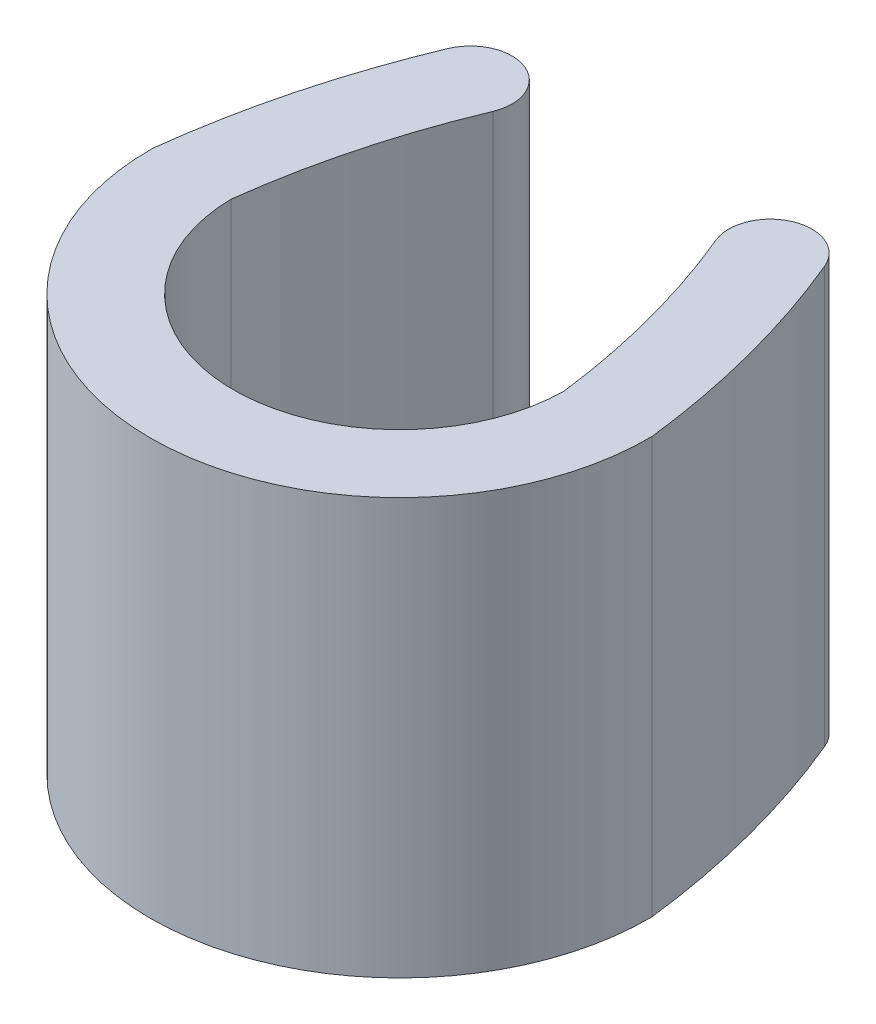
ISO-10303-21;
HEADER;
FILE_DESCRIPTION(('STEP AP214'),'2;1');
FILE_NAME('part.step','',(''),(''),'','','');
FILE_SCHEMA(('AUTOMOTIVE_DESIGN { 1 0 10303 214 1 1 1 1 }'));
ENDSEC;
DATA;
#1=APPLICATION_CONTEXT('core data for automotive mechanical design processes');
#2=APPLICATION_PROTOCOL_DEFINITION('international standard','automotive_design',2000,#1);
#3=PRODUCT_CONTEXT('',#1,'mechanical');
#4=PRODUCT('Part','Part','',(#3));
#5=PRODUCT_RELATED_PRODUCT_CATEGORY('part','',(#4));
#6=PRODUCT_DEFINITION_FORMATION('','',#4);
#7=PRODUCT_DEFINITION_CONTEXT('part definition',#1,'design');
#8=PRODUCT_DEFINITION('design','',#6,#7);
#9=PRODUCT_DEFINITION_SHAPE('','',#8);
#10=(LENGTH_UNIT() NAMED_UNIT(*) SI_UNIT(.MILLI.,.METRE.));
#11=(NAMED_UNIT(*) PLANE_ANGLE_UNIT() SI_UNIT($,.RADIAN.));
#12=(NAMED_UNIT(*) SI_UNIT($,.STERADIAN.) SOLID_ANGLE_UNIT());
#13=UNCERTAINTY_MEASURE_WITH_UNIT(LENGTH_MEASURE(1.E-05),#10,'distance_accuracy_value','');
#14=(GEOMETRIC_REPRESENTATION_CONTEXT(3) GLOBAL_UNCERTAINTY_ASSIGNED_CONTEXT((#13)) GLOBAL_UNIT_ASSIGNED_CONTEXT((#10,
#11,#12)) REPRESENTATION_CONTEXT('',''));
#15=CARTESIAN_POINT('',(0.,0.,0.));
#16=DIRECTION('',(0.,0.,1.));
#17=DIRECTION('',(1.,0.,0.));
#18=AXIS2_PLACEMENT_3D('',#15,#16,#17);
#19=CARTESIAN_POINT('',(-7.42804989922021,5.,1.19742440203698));
#20=DIRECTION('',(0.,-1.,0.));
#21=DIRECTION('',(0.,0.,-1.));
#22=AXIS2_PLACEMENT_3D('',#19,#20,#21);
#23=CYLINDRICAL_SURFACE('',#22,10.5);
#24=CARTESIAN_POINT('',(-7.42804989922021,0.,1.19742440203698));
#25=DIRECTION('',(0.,1.,0.));
#26=DIRECTION('',(0.,0.,1.));
#27=AXIS2_PLACEMENT_3D('',#24,#25,#26);
#28=CIRCLE('',#27,10.5);
#29=CARTESIAN_POINT('',(2.99983941703189,0.,-0.0310398457111388));
#30=VERTEX_POINT('',#29);
#31=CARTESIAN_POINT('',(2.26350014312961,0.,-2.842855016101));
#32=VERTEX_POINT('',#31);
#33=EDGE_CURVE('E145',#30,#32,#28,.T.);
#34=ORIENTED_EDGE('',*,*,#33,.T.);
#35=DIRECTION('',(0.,-1.,0.));
#36=VECTOR('',#35,1.);
#37=CARTESIAN_POINT('',(2.26350014312961,5.,-2.842855016101));
#38=LINE('',#37,#36);
#39=CARTESIAN_POINT('',(2.26350014312961,5.,-2.842855016101));
#40=VERTEX_POINT('',#39);
#41=EDGE_CURVE('E11',#40,#32,#38,.T.);
#42=ORIENTED_EDGE('',*,*,#41,.F.);
#43=CARTESIAN_POINT('',(-7.42804989922021,5.,1.19742440203698));
#44=DIRECTION('',(0.,1.,0.));
#45=DIRECTION('',(0.,0.,1.));
#46=AXIS2_PLACEMENT_3D('',#43,#44,#45);
#47=CIRCLE('',#46,10.5);
#48=CARTESIAN_POINT('',(2.99983941703189,5.,-0.0310398457111388));
#49=VERTEX_POINT('',#48);
#50=EDGE_CURVE('E172',#49,#40,#47,.T.);
#51=ORIENTED_EDGE('',*,*,#50,.F.);
#52=DIRECTION('',(0.,-1.,0.));
#53=VECTOR('',#52,1.);
#54=CARTESIAN_POINT('',(2.99983941703189,5.,-0.0310398457111388));
#55=LINE('',#54,#53);
#56=EDGE_CURVE('E141',#49,#30,#55,.T.);
#57=ORIENTED_EDGE('',*,*,#56,.T.);
#58=EDGE_LOOP('',(#34,#42,#51,#57));
#59=FACE_BOUND('',#58,.T.);
#60=ADVANCED_FACE('F45',(#59),#23,.T.);
#61=CARTESIAN_POINT('',(1.80199776016056,5.,-2.65046075809443));
#62=DIRECTION('',(0.,-1.,0.));
#63=DIRECTION('',(0.,0.,-1.));
#64=AXIS2_PLACEMENT_3D('',#61,#62,#63);
#65=CYLINDRICAL_SURFACE('',#64,0.500000000000001);
#66=CARTESIAN_POINT('',(1.80199776016056,0.,-2.65046075809443));
#67=DIRECTION('',(0.,1.,0.));
#68=DIRECTION('',(0.,0.,1.));
#69=AXIS2_PLACEMENT_3D('',#66,#67,#68);
#70=CIRCLE('',#69,0.500000000000001);
#71=CARTESIAN_POINT('',(1.34049537719153,0.,-2.45806650008786));
#72=VERTEX_POINT('',#71);
#73=EDGE_CURVE('E149',#32,#72,#70,.T.);
#74=ORIENTED_EDGE('',*,*,#73,.T.);
#75=DIRECTION('',(0.,-1.,0.));
#76=VECTOR('',#75,1.);
#77=CARTESIAN_POINT('',(1.34049537719153,5.,-2.45806650008786));
#78=LINE('',#77,#76);
#79=CARTESIAN_POINT('',(1.34049537719153,5.,-2.45806650008786));
#80=VERTEX_POINT('',#79);
#81=EDGE_CURVE('E54',#80,#72,#78,.T.);
#82=ORIENTED_EDGE('',*,*,#81,.F.);
#83=CARTESIAN_POINT('',(1.80199776016056,5.,-2.65046075809443));
#84=DIRECTION('',(0.,1.,0.));
#85=DIRECTION('',(0.,0.,1.));
#86=AXIS2_PLACEMENT_3D('',#83,#84,#85);
#87=CIRCLE('',#86,0.500000000000001);
#88=EDGE_CURVE('E101',#40,#80,#87,.T.);
#89=ORIENTED_EDGE('',*,*,#88,.F.);
#90=ORIENTED_EDGE('',*,*,#41,.T.);
#91=EDGE_LOOP('',(#74,#82,#89,#90));
#92=FACE_BOUND('',#91,.T.);
#93=ADVANCED_FACE('F191',(#92),#65,.T.);
#94=CARTESIAN_POINT('',(-7.42804989922021,5.,1.19742440203698));
#95=DIRECTION('',(0.,-1.,0.));
#96=DIRECTION('',(0.,0.,-1.));
#97=AXIS2_PLACEMENT_3D('',#94,#95,#96);
#98=CYLINDRICAL_SURFACE('',#97,9.5);
#99=CARTESIAN_POINT('',(-7.42804989922021,0.,1.19742440203698));
#100=DIRECTION('',(0.,1.,0.));
#101=DIRECTION('',(0.,0.,1.));
#102=AXIS2_PLACEMENT_3D('',#99,#100,#101);
#103=CIRCLE('',#102,9.5);
#104=CARTESIAN_POINT('',(1.99979319343745,0.,0.0287607976463611));
#105=VERTEX_POINT('',#104);
#106=EDGE_CURVE('E153',#105,#72,#103,.T.);
#107=ORIENTED_EDGE('',*,*,#106,.F.);
#108=DIRECTION('',(0.,-1.,0.));
#109=VECTOR('',#108,1.);
#110=CARTESIAN_POINT('',(1.99979319343745,5.,0.0287607976463611));
#111=LINE('',#110,#109);
#112=CARTESIAN_POINT('',(1.99979319343745,5.,0.0287607976463611));
#113=VERTEX_POINT('',#112);
#114=EDGE_CURVE('E182',#113,#105,#111,.T.);
#115=ORIENTED_EDGE('',*,*,#114,.F.);
#116=CARTESIAN_POINT('',(-7.42804989922021,5.,1.19742440203698));
#117=DIRECTION('',(0.,1.,0.));
#118=DIRECTION('',(0.,0.,1.));
#119=AXIS2_PLACEMENT_3D('',#116,#117,#118);
#120=CIRCLE('',#119,9.5);
#121=EDGE_CURVE('E190',#113,#80,#120,.T.);
#122=ORIENTED_EDGE('',*,*,#121,.T.);
#123=ORIENTED_EDGE('',*,*,#81,.T.);
#124=EDGE_LOOP('',(#107,#115,#122,#123));
#125=FACE_BOUND('',#124,.T.);
#126=ADVANCED_FACE('F188',(#125),#98,.F.);
#127=CARTESIAN_POINT('',(0.,5.,0.));
#128=DIRECTION('',(0.,-1.,0.));
#129=DIRECTION('',(0.,0.,-1.));
#130=AXIS2_PLACEMENT_3D('',#127,#128,#129);
#131=CYLINDRICAL_SURFACE('',#130,2.);
#132=CARTESIAN_POINT('',(0.,0.,0.));
#133=DIRECTION('',(0.,1.,0.));
#134=DIRECTION('',(0.,0.,1.));
#135=AXIS2_PLACEMENT_3D('',#132,#133,#134);
#136=CIRCLE('',#135,2.);
#137=CARTESIAN_POINT('',(-1.99979319343745,0.,0.0287607976463481));
#138=VERTEX_POINT('',#137);
#139=EDGE_CURVE('E157',#138,#105,#136,.T.);
#140=ORIENTED_EDGE('',*,*,#139,.F.);
#141=DIRECTION('',(0.,-1.,0.));
#142=VECTOR('',#141,1.);
#143=CARTESIAN_POINT('',(-1.99979319343745,5.,0.0287607976463481));
#144=LINE('',#143,#142);
#145=CARTESIAN_POINT('',(-1.99979319343745,5.,0.0287607976463481));
#146=VERTEX_POINT('',#145);
#147=EDGE_CURVE('E179',#146,#138,#144,.T.);
#148=ORIENTED_EDGE('',*,*,#147,.F.);
#149=CARTESIAN_POINT('',(0.,5.,0.));
#150=DIRECTION('',(0.,1.,0.));
#151=DIRECTION('',(0.,0.,1.));
#152=AXIS2_PLACEMENT_3D('',#149,#150,#151);
#153=CIRCLE('',#152,2.);
#154=EDGE_CURVE('E201',#146,#113,#153,.T.);
#155=ORIENTED_EDGE('',*,*,#154,.T.);
#156=ORIENTED_EDGE('',*,*,#114,.T.);
#157=EDGE_LOOP('',(#140,#148,#155,#156));
#158=FACE_BOUND('',#157,.T.);
#159=ADVANCED_FACE('F199',(#158),#131,.F.);
#160=CARTESIAN_POINT('',(7.42804989922021,5.,1.19742440203698));
#161=DIRECTION('',(0.,-1.,0.));
#162=DIRECTION('',(0.,0.,-1.));
#163=AXIS2_PLACEMENT_3D('',#160,#161,#162);
#164=CYLINDRICAL_SURFACE('',#163,9.5);
#165=CARTESIAN_POINT('',(7.42804989922021,0.,1.19742440203698));
#166=DIRECTION('',(0.,1.,0.));
#167=DIRECTION('',(0.,0.,1.));
#168=AXIS2_PLACEMENT_3D('',#165,#166,#167);
#169=CIRCLE('',#168,9.5);
#170=CARTESIAN_POINT('',(-1.34049537719153,0.,-2.45806650008785));
#171=VERTEX_POINT('',#170);
#172=EDGE_CURVE('E161',#138,#171,#169,.F.);
#173=ORIENTED_EDGE('',*,*,#172,.T.);
#174=DIRECTION('',(0.,-1.,0.));
#175=VECTOR('',#174,1.);
#176=CARTESIAN_POINT('',(-1.34049537719153,5.,-2.45806650008785));
#177=LINE('',#176,#175);
#178=CARTESIAN_POINT('',(-1.34049537719153,5.,-2.45806650008785));
#179=VERTEX_POINT('',#178);
#180=EDGE_CURVE('E127',#179,#171,#177,.T.);
#181=ORIENTED_EDGE('',*,*,#180,.F.);
#182=CARTESIAN_POINT('',(7.42804989922021,5.,1.19742440203698));
#183=DIRECTION('',(0.,1.,0.));
#184=DIRECTION('',(0.,0.,1.));
#185=AXIS2_PLACEMENT_3D('',#182,#183,#184);
#186=CIRCLE('',#185,9.5);
#187=EDGE_CURVE('E133',#146,#179,#186,.F.);
#188=ORIENTED_EDGE('',*,*,#187,.F.);
#189=ORIENTED_EDGE('',*,*,#147,.T.);
#190=EDGE_LOOP('',(#173,#181,#188,#189));
#191=FACE_BOUND('',#190,.T.);
#192=ADVANCED_FACE('F234',(#191),#164,.F.);
#193=CARTESIAN_POINT('',(-1.80199776016056,5.,-2.65046075809443));
#194=DIRECTION('',(0.,-1.,0.));
#195=DIRECTION('',(0.,0.,-1.));
#196=AXIS2_PLACEMENT_3D('',#193,#194,#195);
#197=CYLINDRICAL_SURFACE('',#196,0.5);
#198=CARTESIAN_POINT('',(-1.80199776016056,0.,-2.65046075809443));
#199=DIRECTION('',(0.,1.,0.));
#200=DIRECTION('',(0.,0.,1.));
#201=AXIS2_PLACEMENT_3D('',#198,#199,#200);
#202=CIRCLE('',#201,0.5);
#203=CARTESIAN_POINT('',(-2.26350014312961,0.,-2.842855016101));
#204=VERTEX_POINT('',#203);
#205=EDGE_CURVE('E121',#204,#171,#202,.F.);
#206=ORIENTED_EDGE('',*,*,#205,.F.);
#207=DIRECTION('',(0.,-1.,0.));
#208=VECTOR('',#207,1.);
#209=CARTESIAN_POINT('',(-2.26350014312961,5.,-2.842855016101));
#210=LINE('',#209,#208);
#211=CARTESIAN_POINT('',(-2.26350014312961,5.,-2.842855016101));
#212=VERTEX_POINT('',#211);
#213=EDGE_CURVE('E116',#212,#204,#210,.T.);
#214=ORIENTED_EDGE('',*,*,#213,.F.);
#215=CARTESIAN_POINT('',(-1.80199776016056,5.,-2.65046075809443));
#216=DIRECTION('',(0.,1.,0.));
#217=DIRECTION('',(0.,0.,1.));
#218=AXIS2_PLACEMENT_3D('',#215,#216,#217);
#219=CIRCLE('',#218,0.5);
#220=EDGE_CURVE('E119',#212,#179,#219,.F.);
#221=ORIENTED_EDGE('',*,*,#220,.T.);
#222=ORIENTED_EDGE('',*,*,#180,.T.);
#223=EDGE_LOOP('',(#206,#214,#221,#222));
#224=FACE_BOUND('',#223,.T.);
#225=ADVANCED_FACE('F118',(#224),#197,.T.);
#226=CARTESIAN_POINT('',(7.42804989922021,5.,1.19742440203698));
#227=DIRECTION('',(0.,-1.,0.));
#228=DIRECTION('',(0.,0.,-1.));
#229=AXIS2_PLACEMENT_3D('',#226,#227,#228);
#230=CYLINDRICAL_SURFACE('',#229,10.5);
#231=CARTESIAN_POINT('',(7.42804989922021,0.,1.19742440203698));
#232=DIRECTION('',(0.,1.,0.));
#233=DIRECTION('',(0.,0.,1.));
#234=AXIS2_PLACEMENT_3D('',#231,#232,#233);
#235=CIRCLE('',#234,10.5);
#236=CARTESIAN_POINT('',(-2.99983941703189,0.,-0.0310398457111441));
#237=VERTEX_POINT('',#236);
#238=EDGE_CURVE('E167',#237,#204,#235,.F.);
#239=ORIENTED_EDGE('',*,*,#238,.F.);
#240=DIRECTION('',(0.,-1.,0.));
#241=VECTOR('',#240,1.);
#242=CARTESIAN_POINT('',(-2.99983941703189,5.,-0.0310398457111441));
#243=LINE('',#242,#241);
#244=CARTESIAN_POINT('',(-2.99983941703189,5.,-0.0310398457111441));
#245=VERTEX_POINT('',#244);
#246=EDGE_CURVE('E90',#245,#237,#243,.T.);
#247=ORIENTED_EDGE('',*,*,#246,.F.);
#248=CARTESIAN_POINT('',(7.42804989922021,5.,1.19742440203698));
#249=DIRECTION('',(0.,1.,0.));
#250=DIRECTION('',(0.,0.,1.));
#251=AXIS2_PLACEMENT_3D('',#248,#249,#250);
#252=CIRCLE('',#251,10.5);
#253=EDGE_CURVE('E130',#245,#212,#252,.F.);
#254=ORIENTED_EDGE('',*,*,#253,.T.);
#255=ORIENTED_EDGE('',*,*,#213,.T.);
#256=EDGE_LOOP('',(#239,#247,#254,#255));
#257=FACE_BOUND('',#256,.T.);
#258=ADVANCED_FACE('F137',(#257),#230,.T.);
#259=CARTESIAN_POINT('',(0.,5.,0.));
#260=DIRECTION('',(0.,-1.,0.));
#261=DIRECTION('',(0.,0.,-1.));
#262=AXIS2_PLACEMENT_3D('',#259,#260,#261);
#263=CYLINDRICAL_SURFACE('',#262,3.);
#264=CARTESIAN_POINT('',(0.,0.,0.));
#265=DIRECTION('',(0.,1.,0.));
#266=DIRECTION('',(0.,0.,1.));
#267=AXIS2_PLACEMENT_3D('',#264,#265,#266);
#268=CIRCLE('',#267,3.);
#269=EDGE_CURVE('E93',#237,#30,#268,.T.);
#270=ORIENTED_EDGE('',*,*,#269,.T.);
#271=ORIENTED_EDGE('',*,*,#56,.F.);
#272=CARTESIAN_POINT('',(0.,5.,0.));
#273=DIRECTION('',(0.,1.,0.));
#274=DIRECTION('',(0.,0.,1.));
#275=AXIS2_PLACEMENT_3D('',#272,#273,#274);
#276=CIRCLE('',#275,3.);
#277=EDGE_CURVE('E62',#245,#49,#276,.T.);
#278=ORIENTED_EDGE('',*,*,#277,.F.);
#279=ORIENTED_EDGE('',*,*,#246,.T.);
#280=EDGE_LOOP('',(#270,#271,#278,#279));
#281=FACE_BOUND('',#280,.T.);
#282=ADVANCED_FACE('F213',(#281),#263,.T.);
#283=CARTESIAN_POINT('',(0.,5.,0.));
#284=DIRECTION('',(0.,1.,0.));
#285=DIRECTION('',(0.,0.,1.));
#286=AXIS2_PLACEMENT_3D('',#283,#284,#285);
#287=PLANE('',#286);
#288=ORIENTED_EDGE('',*,*,#50,.T.);
#289=ORIENTED_EDGE('',*,*,#88,.T.);
#290=ORIENTED_EDGE('',*,*,#121,.F.);
#291=ORIENTED_EDGE('',*,*,#154,.F.);
#292=ORIENTED_EDGE('',*,*,#187,.T.);
#293=ORIENTED_EDGE('',*,*,#220,.F.);
#294=ORIENTED_EDGE('',*,*,#253,.F.);
#295=ORIENTED_EDGE('',*,*,#277,.T.);
#296=EDGE_LOOP('',(#288,#289,#290,#291,#292,#293,#294,#295));
#297=FACE_BOUND('',#296,.T.);
#298=ADVANCED_FACE('F129',(#297),#287,.T.);
#299=CARTESIAN_POINT('',(0.,0.,0.));
#300=DIRECTION('',(0.,1.,0.));
#301=DIRECTION('',(0.,0.,1.));
#302=AXIS2_PLACEMENT_3D('',#299,#300,#301);
#303=PLANE('',#302);
#304=ORIENTED_EDGE('',*,*,#33,.F.);
#305=ORIENTED_EDGE('',*,*,#269,.F.);
#306=ORIENTED_EDGE('',*,*,#238,.T.);
#307=ORIENTED_EDGE('',*,*,#205,.T.);
#308=ORIENTED_EDGE('',*,*,#172,.F.);
#309=ORIENTED_EDGE('',*,*,#139,.T.);
#310=ORIENTED_EDGE('',*,*,#106,.T.);
#311=ORIENTED_EDGE('',*,*,#73,.F.);
#312=EDGE_LOOP('',(#304,#305,#306,#307,#308,#309,#310,#311));
#313=FACE_BOUND('',#312,.T.);
#314=ADVANCED_FACE('F195',(#313),#303,.F.);
#315=CLOSED_SHELL('',(#60,#93,#126,#159,#192,#225,#258,#282,#298,#314));
#316=MANIFOLD_SOLID_BREP('B2',#315);
#317=ADVANCED_BREP_SHAPE_REPRESENTATION('',(#18,#316),#14);
#318=SHAPE_DEFINITION_REPRESENTATION(#9,#317);
ENDSEC;
END-ISO-10303-21;
